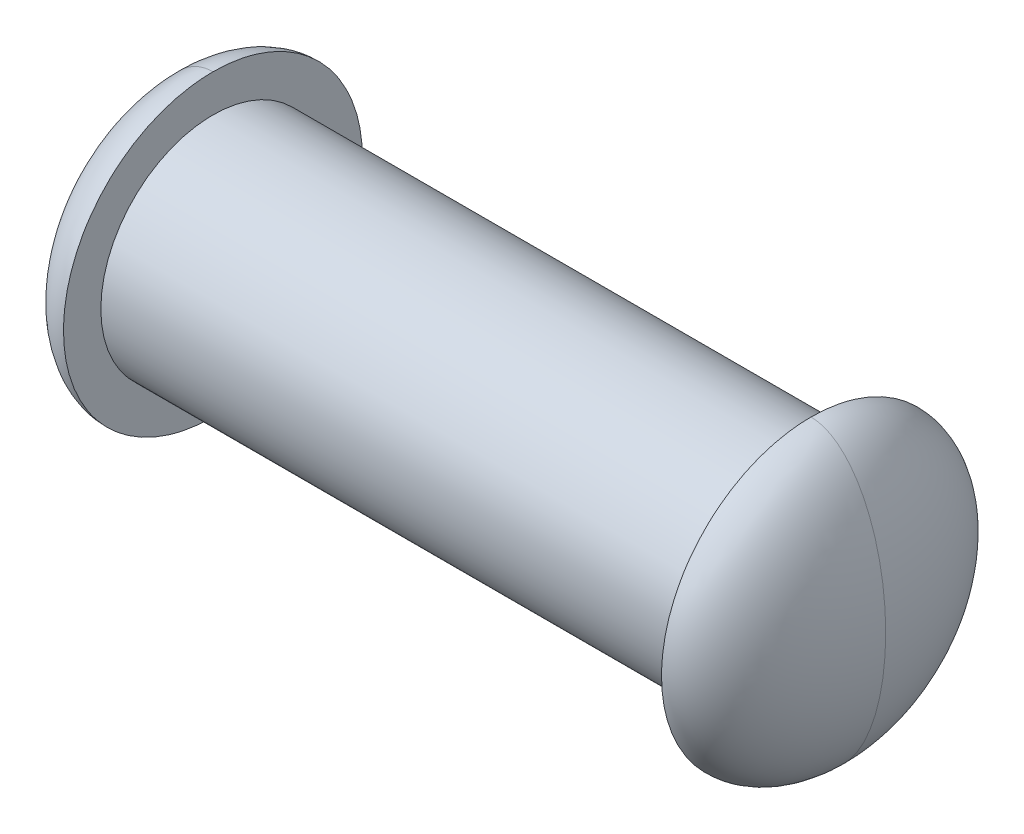
ISO-10303-21;
HEADER;
FILE_DESCRIPTION(('STEP AP214'),'2;1');
FILE_NAME('part.step','',(''),(''),'','','');
FILE_SCHEMA(('AUTOMOTIVE_DESIGN { 1 0 10303 214 1 1 1 1 }'));
ENDSEC;
DATA;
#1=APPLICATION_CONTEXT('core data for automotive mechanical design processes');
#2=APPLICATION_PROTOCOL_DEFINITION('international standard','automotive_design',2000,#1);
#3=PRODUCT_CONTEXT('',#1,'mechanical');
#4=PRODUCT('Part','Part','',(#3));
#5=PRODUCT_RELATED_PRODUCT_CATEGORY('part','',(#4));
#6=PRODUCT_DEFINITION_FORMATION('','',#4);
#7=PRODUCT_DEFINITION_CONTEXT('part definition',#1,'design');
#8=PRODUCT_DEFINITION('design','',#6,#7);
#9=PRODUCT_DEFINITION_SHAPE('','',#8);
#10=(LENGTH_UNIT() NAMED_UNIT(*) SI_UNIT(.MILLI.,.METRE.));
#11=(NAMED_UNIT(*) PLANE_ANGLE_UNIT() SI_UNIT($,.RADIAN.));
#12=(NAMED_UNIT(*) SI_UNIT($,.STERADIAN.) SOLID_ANGLE_UNIT());
#13=UNCERTAINTY_MEASURE_WITH_UNIT(LENGTH_MEASURE(1.E-05),#10,'distance_accuracy_value','');
#14=(GEOMETRIC_REPRESENTATION_CONTEXT(3) GLOBAL_UNCERTAINTY_ASSIGNED_CONTEXT((#13)) GLOBAL_UNIT_ASSIGNED_CONTEXT((#10,
#11,#12)) REPRESENTATION_CONTEXT('',''));
#15=CARTESIAN_POINT('',(0.,0.,0.));
#16=DIRECTION('',(0.,0.,1.));
#17=DIRECTION('',(1.,0.,0.));
#18=AXIS2_PLACEMENT_3D('',#15,#16,#17);
#19=CARTESIAN_POINT('',(-4.,-2.,0.));
#20=CARTESIAN_POINT('',(-4.,-2.,4.));
#21=CARTESIAN_POINT('',(-4.,2.,4.));
#22=CARTESIAN_POINT('',(-4.,2.,0.));
#23=CARTESIAN_POINT('',(-4.585786438,-2.,0.));
#24=CARTESIAN_POINT('',(-4.585786438,-2.,4.));
#25=CARTESIAN_POINT('',(-4.585786438,2.,4.));
#26=CARTESIAN_POINT('',(-4.585786438,2.,0.));
#27=CARTESIAN_POINT('',(-5.,-1.171572875,0.));
#28=CARTESIAN_POINT('',(-5.,-1.171572875,2.343145751));
#29=CARTESIAN_POINT('',(-5.,1.171572875,2.343145751));
#30=CARTESIAN_POINT('',(-5.,1.171572875,0.));
#31=CARTESIAN_POINT('',(-5.,0.,0.));
#32=CARTESIAN_POINT('',(-5.,0.,0.));
#33=CARTESIAN_POINT('',(-5.,0.,0.));
#34=CARTESIAN_POINT('',(-5.,0.,0.));
#35=(BOUNDED_SURFACE() B_SPLINE_SURFACE(3,3,((#19,#20,#21,#22),(#23,#24,#25,#26),(#27,#28,#29,
#30),(#31,#32,#33,#34)),.UNSPECIFIED.,.F.,.F.,.F.) B_SPLINE_SURFACE_WITH_KNOTS((4,4),(4,4),(0.,
1.),(0.,1.),.UNSPECIFIED.) GEOMETRIC_REPRESENTATION_ITEM() RATIONAL_B_SPLINE_SURFACE(((1.,
0.333333333333333,0.333333333333333,1.),(0.804737854124365,0.268245951374788,0.268245951374788,
0.804737854124365),(0.804737854124365,0.268245951374788,0.268245951374788,0.804737854124365),
(1.,0.333333333333333,0.333333333333333,1.))) REPRESENTATION_ITEM('') SURFACE());
#36=CARTESIAN_POINT('',(-4.,-2.,0.));
#37=CARTESIAN_POINT('',(-4.,-1.99999962641447,0.0562680229619233));
#38=CARTESIAN_POINT('',(-4.,-1.99762394300518,0.112509087930596));
#39=CARTESIAN_POINT('',(-4.,-1.9881463739492,0.224588791283825));
#40=CARTESIAN_POINT('',(-4.,-1.98104471460144,0.28042744880788));
#41=CARTESIAN_POINT('',(-4.,-1.95271723958908,0.446648063709757));
#42=CARTESIAN_POINT('',(-4.,-1.92446874657418,0.555916554788708));
#43=CARTESIAN_POINT('',(-4.,-1.85002914799462,0.768155068249139));
#44=CARTESIAN_POINT('',(-4.,-1.80382971785695,0.871122142729097));
#45=CARTESIAN_POINT('',(-4.,-1.69480587148286,1.06783350824989));
#46=CARTESIAN_POINT('',(-4.,-1.63198472136682,1.16157960622734));
#47=CARTESIAN_POINT('',(-4.,-1.49149611993653,1.33719357958562));
#48=CARTESIAN_POINT('',(-4.,-1.41382834132565,1.41906119303309));
#49=CARTESIAN_POINT('',(-4.,-1.24583855555913,1.56860880173396));
#50=CARTESIAN_POINT('',(-4.,-1.15551462307745,1.63628663443956));
#51=CARTESIAN_POINT('',(-4.,-0.964790249798286,1.75551336645388));
#52=CARTESIAN_POINT('',(-4.,-0.864390254004212,1.80706297764236));
#53=CARTESIAN_POINT('',(-4.,-0.656367388949257,1.89257162478123));
#54=CARTESIAN_POINT('',(-4.,-0.548744982224535,1.92653178597954));
#55=CARTESIAN_POINT('',(-4.,-0.329323889979723,1.97590271771947));
#56=CARTESIAN_POINT('',(-4.,-0.217525118924828,1.99131310813408));
#57=CARTESIAN_POINT('',(-4.,0.00707455170492986,2.00314687524351));
#58=CARTESIAN_POINT('',(-4.,0.119875474270174,1.99956981521806));
#59=CARTESIAN_POINT('',(-4.,0.343277698620538,1.97352584666787));
#60=CARTESIAN_POINT('',(-4.,0.453879022201218,1.95105912541404));
#61=CARTESIAN_POINT('',(-4.,0.669728020212934,1.88788698181247));
#62=CARTESIAN_POINT('',(-4.,0.774975711626932,1.84718161732595));
#63=CARTESIAN_POINT('',(-4.,0.977189487563661,1.74863777661584));
#64=CARTESIAN_POINT('',(-4.,1.07415535495195,1.69079885135884));
#65=CARTESIAN_POINT('',(-4.,1.21118381531814,1.59254679176868));
#66=CARTESIAN_POINT('',(-4.,1.25546374327093,1.55787326470221));
#67=CARTESIAN_POINT('',(-4.,1.34099378976153,1.48488999924051));
#68=CARTESIAN_POINT('',(-4.,1.38224094312319,1.44657678398915));
#69=CARTESIAN_POINT('',(-4.,1.50085475444602,1.32666910931567));
#70=CARTESIAN_POINT('',(-4.,1.57321655880106,1.2400183877163));
#71=CARTESIAN_POINT('',(-4.,1.7023417008121,1.05578606563579));
#72=CARTESIAN_POINT('',(-4.,1.75910563171886,0.958204881083524));
#73=CARTESIAN_POINT('',(-4.,1.83136904197552,0.805772155456572));
#74=CARTESIAN_POINT('',(-4.,1.85332586226793,0.753894007216334));
#75=CARTESIAN_POINT('',(-4.,1.89277724350991,0.648500919330629));
#76=CARTESIAN_POINT('',(-4.,1.91027541856335,0.594987344997413));
#77=CARTESIAN_POINT('',(-4.,1.94068278370897,0.486733933235352));
#78=CARTESIAN_POINT('',(-4.,1.95359646502991,0.431995352103915));
#79=CARTESIAN_POINT('',(-4.,1.97476719522395,0.321635163360166));
#80=CARTESIAN_POINT('',(-4.,1.98302560811863,0.266013819318918));
#81=CARTESIAN_POINT('',(-4.,1.99261890883154,0.175226234050916));
#82=CARTESIAN_POINT('',(-4.,1.99538857922048,0.140205275145587));
#83=CARTESIAN_POINT('',(-4.,1.99907778719133,0.0701241102824082));
#84=CARTESIAN_POINT('',(-4.,2.0000003757604,0.0350640649155608));
#85=CARTESIAN_POINT('',(-4.,2.,0.));
#86=B_SPLINE_CURVE_WITH_KNOTS('',3,(#36,#37,#38,#39,#40,#41,#42,#43,#44,#45,#46,#47,#48,#49,#50,
#51,#52,#53,#54,#55,#56,#57,#58,#59,#60,#61,#62,#63,#64,#65,#66,#67,#68,#69,#70,#71,#72,#73,#74,
#75,#76,#77,#78,#79,#80,#81,#82,#83,#84,#85),.UNSPECIFIED.,.F.,.F.,(4,2,2,2,2,2,2,2,2,2,2,2,2,2,
2,2,2,2,2,2,2,2,2,2,4),(0.,0.168700384984718,0.337392692490235,0.674238578630678,
1.01124086057953,1.34817697166002,1.6851205114153,2.02211536469862,2.35909534134666,
2.69605375774872,3.03301907907773,3.36999215080096,3.70696188183357,4.04393054385351,
4.38090803787167,4.54945707455141,4.71816877054622,5.05514437623786,5.39210716359791,
5.56093987110553,5.7296352871162,5.89816498054248,6.06664526805524,6.1719914868906,
6.27716355208919),.UNSPECIFIED.);
#87=CARTESIAN_POINT('',(-4.,-2.,0.));
#88=VERTEX_POINT('',#87);
#89=CARTESIAN_POINT('',(-4.,2.,0.));
#90=VERTEX_POINT('',#89);
#91=EDGE_CURVE('E22',#88,#90,#86,.T.);
#92=CARTESIAN_POINT('',(-4.,2.,0.));
#93=CARTESIAN_POINT('',(-4.585786438,2.,0.));
#94=CARTESIAN_POINT('',(-5.,1.171572875,0.));
#95=CARTESIAN_POINT('',(-5.,0.,0.));
#96=(BOUNDED_CURVE() B_SPLINE_CURVE(3,(#92,#93,#94,#95),.UNSPECIFIED.,.F.,
.F.) B_SPLINE_CURVE_WITH_KNOTS((4,4),(0.,1.),
.UNSPECIFIED.) CURVE() GEOMETRIC_REPRESENTATION_ITEM() RATIONAL_B_SPLINE_CURVE((1.,
0.804737854124365,0.804737854124365,1.)) REPRESENTATION_ITEM(''));
#97=CARTESIAN_POINT('',(-5.,0.,0.));
#98=VERTEX_POINT('',#97);
#99=EDGE_CURVE('E59',#90,#98,#96,.T.);
#100=CARTESIAN_POINT('',(-4.,-2.,0.));
#101=CARTESIAN_POINT('',(-4.585786438,-2.,0.));
#102=CARTESIAN_POINT('',(-5.,-1.171572875,0.));
#103=CARTESIAN_POINT('',(-5.,0.,0.));
#104=(BOUNDED_CURVE() B_SPLINE_CURVE(3,(#100,#101,#102,#103),.UNSPECIFIED.,.F.,
.F.) B_SPLINE_CURVE_WITH_KNOTS((4,4),(0.,1.),
.UNSPECIFIED.) CURVE() GEOMETRIC_REPRESENTATION_ITEM() RATIONAL_B_SPLINE_CURVE((1.,
0.804737854124365,0.804737854124365,1.)) REPRESENTATION_ITEM(''));
#105=EDGE_CURVE('E62',#98,#88,#104,.F.);
#106=ORIENTED_EDGE('',*,*,#91,.T.);
#107=ORIENTED_EDGE('',*,*,#99,.T.);
#108=ORIENTED_EDGE('',*,*,#105,.T.);
#109=EDGE_LOOP('',(#106,#107,#108));
#110=FACE_BOUND('',#109,.T.);
#111=ADVANCED_FACE('F17',(#110),#35,.F.);
#112=CARTESIAN_POINT('',(-4.,2.,0.));
#113=CARTESIAN_POINT('',(-4.,2.,-4.));
#114=CARTESIAN_POINT('',(-4.,-2.,-4.));
#115=CARTESIAN_POINT('',(-4.,-2.,0.));
#116=CARTESIAN_POINT('',(-4.585786438,2.,0.));
#117=CARTESIAN_POINT('',(-4.585786438,2.,-4.));
#118=CARTESIAN_POINT('',(-4.585786438,-2.,-4.));
#119=CARTESIAN_POINT('',(-4.585786438,-2.,0.));
#120=CARTESIAN_POINT('',(-5.,1.171572875,0.));
#121=CARTESIAN_POINT('',(-5.,1.171572875,-2.343145751));
#122=CARTESIAN_POINT('',(-5.,-1.171572875,-2.343145751));
#123=CARTESIAN_POINT('',(-5.,-1.171572875,0.));
#124=CARTESIAN_POINT('',(-5.,0.,0.));
#125=CARTESIAN_POINT('',(-5.,0.,0.));
#126=CARTESIAN_POINT('',(-5.,0.,0.));
#127=CARTESIAN_POINT('',(-5.,0.,0.));
#128=(BOUNDED_SURFACE() B_SPLINE_SURFACE(3,3,((#112,#113,#114,#115),(#116,#117,#118,#119),(#120,
#121,#122,#123),(#124,#125,#126,#127)),.UNSPECIFIED.,.F.,.F.,
.F.) B_SPLINE_SURFACE_WITH_KNOTS((4,4),(4,4),(0.,1.),(0.,1.),
.UNSPECIFIED.) GEOMETRIC_REPRESENTATION_ITEM() RATIONAL_B_SPLINE_SURFACE(((1.,0.333333333333333,
0.333333333333333,1.),(0.804737854124365,0.268245951374788,0.268245951374788,0.804737854124365),
(0.804737854124365,0.268245951374788,0.268245951374788,0.804737854124365),(1.,0.333333333333333,
0.333333333333333,1.))) REPRESENTATION_ITEM('') SURFACE());
#129=CARTESIAN_POINT('',(-4.,2.,0.));
#130=CARTESIAN_POINT('',(-4.,1.99999962641447,-0.0562680229619233));
#131=CARTESIAN_POINT('',(-4.,1.99762394300518,-0.112509087930596));
#132=CARTESIAN_POINT('',(-4.,1.9881463739492,-0.224588791283825));
#133=CARTESIAN_POINT('',(-4.,1.98104471460144,-0.28042744880788));
#134=CARTESIAN_POINT('',(-4.,1.95271723958908,-0.446648063709757));
#135=CARTESIAN_POINT('',(-4.,1.92446874657418,-0.555916554788708));
#136=CARTESIAN_POINT('',(-4.,1.85002914799462,-0.768155068249139));
#137=CARTESIAN_POINT('',(-4.,1.80382971785695,-0.871122142729097));
#138=CARTESIAN_POINT('',(-4.,1.69480587148286,-1.06783350824989));
#139=CARTESIAN_POINT('',(-4.,1.63198472136682,-1.16157960622734));
#140=CARTESIAN_POINT('',(-4.,1.49149611993653,-1.33719357958562));
#141=CARTESIAN_POINT('',(-4.,1.41382834132565,-1.41906119303309));
#142=CARTESIAN_POINT('',(-4.,1.24583855555913,-1.56860880173396));
#143=CARTESIAN_POINT('',(-4.,1.15551462307745,-1.63628663443956));
#144=CARTESIAN_POINT('',(-4.,0.964790249798286,-1.75551336645388));
#145=CARTESIAN_POINT('',(-4.,0.864390254004212,-1.80706297764236));
#146=CARTESIAN_POINT('',(-4.,0.656367388949257,-1.89257162478123));
#147=CARTESIAN_POINT('',(-4.,0.548744982224535,-1.92653178597954));
#148=CARTESIAN_POINT('',(-4.,0.329323889979723,-1.97590271771947));
#149=CARTESIAN_POINT('',(-4.,0.217525118924828,-1.99131310813408));
#150=CARTESIAN_POINT('',(-4.,-0.00707455170492986,-2.00314687524351));
#151=CARTESIAN_POINT('',(-4.,-0.119875474270174,-1.99956981521806));
#152=CARTESIAN_POINT('',(-4.,-0.343277698620538,-1.97352584666787));
#153=CARTESIAN_POINT('',(-4.,-0.453879022201218,-1.95105912541404));
#154=CARTESIAN_POINT('',(-4.,-0.669728020212934,-1.88788698181247));
#155=CARTESIAN_POINT('',(-4.,-0.774975711626932,-1.84718161732595));
#156=CARTESIAN_POINT('',(-4.,-0.977189487563661,-1.74863777661584));
#157=CARTESIAN_POINT('',(-4.,-1.07415535495195,-1.69079885135884));
#158=CARTESIAN_POINT('',(-4.,-1.21118381531814,-1.59254679176868));
#159=CARTESIAN_POINT('',(-4.,-1.25546374327093,-1.55787326470221));
#160=CARTESIAN_POINT('',(-4.,-1.34099378976153,-1.48488999924051));
#161=CARTESIAN_POINT('',(-4.,-1.38224094312319,-1.44657678398915));
#162=CARTESIAN_POINT('',(-4.,-1.50085475444602,-1.32666910931567));
#163=CARTESIAN_POINT('',(-4.,-1.57321655880106,-1.2400183877163));
#164=CARTESIAN_POINT('',(-4.,-1.7023417008121,-1.05578606563579));
#165=CARTESIAN_POINT('',(-4.,-1.75910563171886,-0.958204881083524));
#166=CARTESIAN_POINT('',(-4.,-1.83136904197552,-0.805772155456572));
#167=CARTESIAN_POINT('',(-4.,-1.85332586226793,-0.753894007216334));
#168=CARTESIAN_POINT('',(-4.,-1.89277724350991,-0.648500919330629));
#169=CARTESIAN_POINT('',(-4.,-1.91027541856335,-0.594987344997413));
#170=CARTESIAN_POINT('',(-4.,-1.94068278370897,-0.486733933235352));
#171=CARTESIAN_POINT('',(-4.,-1.95359646502991,-0.431995352103915));
#172=CARTESIAN_POINT('',(-4.,-1.97476719522395,-0.321635163360166));
#173=CARTESIAN_POINT('',(-4.,-1.98302560811863,-0.266013819318918));
#174=CARTESIAN_POINT('',(-4.,-1.99261890883154,-0.175226234050916));
#175=CARTESIAN_POINT('',(-4.,-1.99538857922048,-0.140205275145587));
#176=CARTESIAN_POINT('',(-4.,-1.99907778719133,-0.0701241102824082));
#177=CARTESIAN_POINT('',(-4.,-2.0000003757604,-0.0350640649155608));
#178=CARTESIAN_POINT('',(-4.,-2.,0.));
#179=B_SPLINE_CURVE_WITH_KNOTS('',3,(#129,#130,#131,#132,#133,#134,#135,#136,#137,#138,#139,
#140,#141,#142,#143,#144,#145,#146,#147,#148,#149,#150,#151,#152,#153,#154,#155,#156,#157,#158,
#159,#160,#161,#162,#163,#164,#165,#166,#167,#168,#169,#170,#171,#172,#173,#174,#175,#176,#177,
#178),.UNSPECIFIED.,.F.,.F.,(4,2,2,2,2,2,2,2,2,2,2,2,2,2,2,2,2,2,2,2,2,2,2,2,4),(0.,
0.168700384984718,0.337392692490235,0.674238578630678,1.01124086057953,1.34817697166002,
1.6851205114153,2.02211536469862,2.35909534134666,2.69605375774872,3.03301907907773,
3.36999215080096,3.70696188183357,4.04393054385351,4.38090803787167,4.54945707455141,
4.71816877054622,5.05514437623786,5.39210716359791,5.56093987110553,5.7296352871162,
5.89816498054248,6.06664526805524,6.1719914868906,6.27716355208919),.UNSPECIFIED.);
#180=EDGE_CURVE('E61',#90,#88,#179,.T.);
#181=ORIENTED_EDGE('',*,*,#105,.F.);
#182=ORIENTED_EDGE('',*,*,#99,.F.);
#183=ORIENTED_EDGE('',*,*,#180,.T.);
#184=EDGE_LOOP('',(#181,#182,#183));
#185=FACE_BOUND('',#184,.T.);
#186=ADVANCED_FACE('F60',(#185),#128,.F.);
#187=CARTESIAN_POINT('',(-4.,2.024,-2.024));
#188=DIRECTION('',(-1.,0.,0.));
#189=DIRECTION('',(0.,-1.,0.));
#190=AXIS2_PLACEMENT_3D('',#187,#188,#189);
#191=PLANE('',#190);
#192=CARTESIAN_POINT('',(-4.,0.,0.));
#193=DIRECTION('',(-1.,0.,0.));
#194=DIRECTION('',(0.,0.,1.));
#195=AXIS2_PLACEMENT_3D('',#192,#193,#194);
#196=CIRCLE('',#195,1.5);
#197=CARTESIAN_POINT('',(-4.,0.,1.5));
#198=VERTEX_POINT('',#197);
#199=EDGE_CURVE('E66',#198,#198,#196,.T.);
#200=ORIENTED_EDGE('',*,*,#199,.T.);
#201=EDGE_LOOP('',(#200));
#202=FACE_BOUND('',#201,.T.);
#203=ORIENTED_EDGE('',*,*,#91,.F.);
#204=ORIENTED_EDGE('',*,*,#180,.F.);
#205=EDGE_LOOP('',(#203,#204));
#206=FACE_BOUND('',#205,.T.);
#207=ADVANCED_FACE('F65',(#202,#206),#191,.F.);
#208=CARTESIAN_POINT('',(4.,0.,0.));
#209=DIRECTION('',(-1.,0.,0.));
#210=DIRECTION('',(0.,0.,1.));
#211=AXIS2_PLACEMENT_3D('',#208,#209,#210);
#212=CYLINDRICAL_SURFACE('',#211,1.5);
#213=ORIENTED_EDGE('',*,*,#199,.F.);
#214=EDGE_LOOP('',(#213));
#215=FACE_BOUND('',#214,.T.);
#216=CARTESIAN_POINT('',(4.,0.,0.));
#217=DIRECTION('',(-1.,0.,0.));
#218=DIRECTION('',(0.,0.,1.));
#219=AXIS2_PLACEMENT_3D('',#216,#217,#218);
#220=CIRCLE('',#219,1.5);
#221=CARTESIAN_POINT('',(4.,0.,1.5));
#222=VERTEX_POINT('',#221);
#223=EDGE_CURVE('E153',#222,#222,#220,.T.);
#224=ORIENTED_EDGE('',*,*,#223,.T.);
#225=EDGE_LOOP('',(#224));
#226=FACE_BOUND('',#225,.T.);
#227=ADVANCED_FACE('F118',(#215,#226),#212,.T.);
#228=CARTESIAN_POINT('',(4.,-2.024,-2.024));
#229=DIRECTION('',(1.,0.,0.));
#230=DIRECTION('',(0.,1.,0.));
#231=AXIS2_PLACEMENT_3D('',#228,#229,#230);
#232=PLANE('',#231);
#233=ORIENTED_EDGE('',*,*,#223,.F.);
#234=EDGE_LOOP('',(#233));
#235=FACE_BOUND('',#234,.T.);
#236=CARTESIAN_POINT('',(4.,-2.,0.));
#237=CARTESIAN_POINT('',(4.,-1.99999962641447,0.0562680229619233));
#238=CARTESIAN_POINT('',(4.,-1.99762394300518,0.112509087930596));
#239=CARTESIAN_POINT('',(4.,-1.9881463739492,0.224588791283825));
#240=CARTESIAN_POINT('',(4.,-1.98104471460144,0.28042744880788));
#241=CARTESIAN_POINT('',(4.,-1.95271723958908,0.446648063709757));
#242=CARTESIAN_POINT('',(4.,-1.92446874657418,0.555916554788708));
#243=CARTESIAN_POINT('',(4.,-1.85002914799462,0.768155068249139));
#244=CARTESIAN_POINT('',(4.,-1.80382971785695,0.871122142729097));
#245=CARTESIAN_POINT('',(4.,-1.69480587148286,1.06783350824989));
#246=CARTESIAN_POINT('',(4.,-1.63198472136682,1.16157960622734));
#247=CARTESIAN_POINT('',(4.,-1.49149611993653,1.33719357958562));
#248=CARTESIAN_POINT('',(4.,-1.41382834132565,1.41906119303309));
#249=CARTESIAN_POINT('',(4.,-1.24583855555913,1.56860880173396));
#250=CARTESIAN_POINT('',(4.,-1.15551462307744,1.63628663443956));
#251=CARTESIAN_POINT('',(4.,-0.964790249798285,1.75551336645388));
#252=CARTESIAN_POINT('',(4.,-0.864390254004212,1.80706297764236));
#253=CARTESIAN_POINT('',(4.,-0.656367388949256,1.89257162478123));
#254=CARTESIAN_POINT('',(4.,-0.548744982224535,1.92653178597954));
#255=CARTESIAN_POINT('',(4.,-0.329323889979722,1.97590271771947));
#256=CARTESIAN_POINT('',(4.,-0.217525118924827,1.99131310813408));
#257=CARTESIAN_POINT('',(4.,0.00707455170493081,2.00314687524351));
#258=CARTESIAN_POINT('',(4.,0.119875474270175,1.99956981521806));
#259=CARTESIAN_POINT('',(4.,0.343277698620539,1.97352584666787));
#260=CARTESIAN_POINT('',(4.,0.453879022201218,1.95105912541404));
#261=CARTESIAN_POINT('',(4.,0.669728020212935,1.88788698181247));
#262=CARTESIAN_POINT('',(4.,0.774975711626933,1.84718161732594));
#263=CARTESIAN_POINT('',(4.,0.977189487563661,1.74863777661584));
#264=CARTESIAN_POINT('',(4.,1.07415535495195,1.69079885135884));
#265=CARTESIAN_POINT('',(4.,1.21118381531814,1.59254679176868));
#266=CARTESIAN_POINT('',(4.,1.25546374327093,1.55787326470221));
#267=CARTESIAN_POINT('',(4.,1.34099378976153,1.48488999924051));
#268=CARTESIAN_POINT('',(4.,1.38224094312319,1.44657678398915));
#269=CARTESIAN_POINT('',(4.,1.50085475444602,1.32666910931567));
#270=CARTESIAN_POINT('',(4.,1.57321655880106,1.2400183877163));
#271=CARTESIAN_POINT('',(4.,1.7023417008121,1.05578606563579));
#272=CARTESIAN_POINT('',(4.,1.75910563171886,0.958204881083524));
#273=CARTESIAN_POINT('',(4.,1.83136904197552,0.805772155456572));
#274=CARTESIAN_POINT('',(4.,1.85332586226793,0.753894007216334));
#275=CARTESIAN_POINT('',(4.,1.89277724350991,0.648500919330629));
#276=CARTESIAN_POINT('',(4.,1.91027541856335,0.594987344997413));
#277=CARTESIAN_POINT('',(4.,1.94068278370897,0.486733933235352));
#278=CARTESIAN_POINT('',(4.,1.95359646502991,0.431995352103915));
#279=CARTESIAN_POINT('',(4.,1.97476719522395,0.321635163360166));
#280=CARTESIAN_POINT('',(4.,1.98302560811863,0.266013819318918));
#281=CARTESIAN_POINT('',(4.,1.99261890883154,0.175226234050916));
#282=CARTESIAN_POINT('',(4.,1.99538857922048,0.140205275145587));
#283=CARTESIAN_POINT('',(4.,1.99907778719133,0.0701241102824082));
#284=CARTESIAN_POINT('',(4.,2.0000003757604,0.0350640649155608));
#285=CARTESIAN_POINT('',(4.,2.,0.));
#286=B_SPLINE_CURVE_WITH_KNOTS('',3,(#236,#237,#238,#239,#240,#241,#242,#243,#244,#245,#246,
#247,#248,#249,#250,#251,#252,#253,#254,#255,#256,#257,#258,#259,#260,#261,#262,#263,#264,#265,
#266,#267,#268,#269,#270,#271,#272,#273,#274,#275,#276,#277,#278,#279,#280,#281,#282,#283,#284,
#285),.UNSPECIFIED.,.F.,.F.,(4,2,2,2,2,2,2,2,2,2,2,2,2,2,2,2,2,2,2,2,2,2,2,2,4),(0.,
0.168700384984718,0.337392692490235,0.674238578630678,1.01124086057953,1.34817697166002,
1.6851205114153,2.02211536469862,2.35909534134666,2.69605375774872,3.03301907907773,
3.36999215080096,3.70696188183357,4.04393054385352,4.38090803787167,4.54945707455141,
4.71816877054622,5.05514437623786,5.39210716359791,5.56093987110553,5.7296352871162,
5.89816498054248,6.06664526805524,6.1719914868906,6.27716355208919),.UNSPECIFIED.);
#287=CARTESIAN_POINT('',(4.,-2.,0.));
#288=VERTEX_POINT('',#287);
#289=CARTESIAN_POINT('',(4.,2.,0.));
#290=VERTEX_POINT('',#289);
#291=EDGE_CURVE('E94',#288,#290,#286,.T.);
#292=ORIENTED_EDGE('',*,*,#291,.T.);
#293=CARTESIAN_POINT('',(4.,2.,0.));
#294=CARTESIAN_POINT('',(4.,1.99999962641447,-0.0562680229619233));
#295=CARTESIAN_POINT('',(4.,1.99762394300518,-0.112509087930596));
#296=CARTESIAN_POINT('',(4.,1.9881463739492,-0.224588791283825));
#297=CARTESIAN_POINT('',(4.,1.98104471460144,-0.28042744880788));
#298=CARTESIAN_POINT('',(4.,1.95271723958908,-0.446648063709757));
#299=CARTESIAN_POINT('',(4.,1.92446874657418,-0.555916554788708));
#300=CARTESIAN_POINT('',(4.,1.85002914799462,-0.768155068249139));
#301=CARTESIAN_POINT('',(4.,1.80382971785695,-0.871122142729097));
#302=CARTESIAN_POINT('',(4.,1.69480587148286,-1.06783350824989));
#303=CARTESIAN_POINT('',(4.,1.63198472136682,-1.16157960622734));
#304=CARTESIAN_POINT('',(4.,1.49149611993653,-1.33719357958562));
#305=CARTESIAN_POINT('',(4.,1.41382834132565,-1.41906119303309));
#306=CARTESIAN_POINT('',(4.,1.24583855555913,-1.56860880173396));
#307=CARTESIAN_POINT('',(4.,1.15551462307744,-1.63628663443956));
#308=CARTESIAN_POINT('',(4.,0.964790249798285,-1.75551336645388));
#309=CARTESIAN_POINT('',(4.,0.864390254004212,-1.80706297764236));
#310=CARTESIAN_POINT('',(4.,0.656367388949256,-1.89257162478123));
#311=CARTESIAN_POINT('',(4.,0.548744982224535,-1.92653178597954));
#312=CARTESIAN_POINT('',(4.,0.329323889979722,-1.97590271771947));
#313=CARTESIAN_POINT('',(4.,0.217525118924827,-1.99131310813408));
#314=CARTESIAN_POINT('',(4.,-0.00707455170493081,-2.00314687524351));
#315=CARTESIAN_POINT('',(4.,-0.119875474270175,-1.99956981521806));
#316=CARTESIAN_POINT('',(4.,-0.343277698620539,-1.97352584666787));
#317=CARTESIAN_POINT('',(4.,-0.453879022201218,-1.95105912541404));
#318=CARTESIAN_POINT('',(4.,-0.669728020212935,-1.88788698181247));
#319=CARTESIAN_POINT('',(4.,-0.774975711626933,-1.84718161732594));
#320=CARTESIAN_POINT('',(4.,-0.977189487563661,-1.74863777661584));
#321=CARTESIAN_POINT('',(4.,-1.07415535495195,-1.69079885135884));
#322=CARTESIAN_POINT('',(4.,-1.21118381531814,-1.59254679176868));
#323=CARTESIAN_POINT('',(4.,-1.25546374327093,-1.55787326470221));
#324=CARTESIAN_POINT('',(4.,-1.34099378976153,-1.48488999924051));
#325=CARTESIAN_POINT('',(4.,-1.38224094312319,-1.44657678398915));
#326=CARTESIAN_POINT('',(4.,-1.50085475444602,-1.32666910931567));
#327=CARTESIAN_POINT('',(4.,-1.57321655880106,-1.2400183877163));
#328=CARTESIAN_POINT('',(4.,-1.7023417008121,-1.05578606563579));
#329=CARTESIAN_POINT('',(4.,-1.75910563171886,-0.958204881083524));
#330=CARTESIAN_POINT('',(4.,-1.83136904197552,-0.805772155456572));
#331=CARTESIAN_POINT('',(4.,-1.85332586226793,-0.753894007216334));
#332=CARTESIAN_POINT('',(4.,-1.89277724350991,-0.648500919330629));
#333=CARTESIAN_POINT('',(4.,-1.91027541856335,-0.594987344997413));
#334=CARTESIAN_POINT('',(4.,-1.94068278370897,-0.486733933235352));
#335=CARTESIAN_POINT('',(4.,-1.95359646502991,-0.431995352103915));
#336=CARTESIAN_POINT('',(4.,-1.97476719522395,-0.321635163360166));
#337=CARTESIAN_POINT('',(4.,-1.98302560811863,-0.266013819318918));
#338=CARTESIAN_POINT('',(4.,-1.99261890883154,-0.175226234050916));
#339=CARTESIAN_POINT('',(4.,-1.99538857922048,-0.140205275145587));
#340=CARTESIAN_POINT('',(4.,-1.99907778719133,-0.0701241102824082));
#341=CARTESIAN_POINT('',(4.,-2.0000003757604,-0.0350640649155608));
#342=CARTESIAN_POINT('',(4.,-2.,0.));
#343=B_SPLINE_CURVE_WITH_KNOTS('',3,(#293,#294,#295,#296,#297,#298,#299,#300,#301,#302,#303,
#304,#305,#306,#307,#308,#309,#310,#311,#312,#313,#314,#315,#316,#317,#318,#319,#320,#321,#322,
#323,#324,#325,#326,#327,#328,#329,#330,#331,#332,#333,#334,#335,#336,#337,#338,#339,#340,#341,
#342),.UNSPECIFIED.,.F.,.F.,(4,2,2,2,2,2,2,2,2,2,2,2,2,2,2,2,2,2,2,2,2,2,2,2,4),(0.,
0.168700384984718,0.337392692490235,0.674238578630678,1.01124086057953,1.34817697166002,
1.6851205114153,2.02211536469862,2.35909534134666,2.69605375774872,3.03301907907773,
3.36999215080096,3.70696188183357,4.04393054385352,4.38090803787167,4.54945707455141,
4.71816877054622,5.05514437623786,5.39210716359791,5.56093987110553,5.7296352871162,
5.89816498054248,6.06664526805524,6.1719914868906,6.27716355208919),.UNSPECIFIED.);
#344=EDGE_CURVE('E83',#290,#288,#343,.T.);
#345=ORIENTED_EDGE('',*,*,#344,.T.);
#346=EDGE_LOOP('',(#292,#345));
#347=FACE_BOUND('',#346,.T.);
#348=ADVANCED_FACE('F19',(#235,#347),#232,.F.);
#349=CARTESIAN_POINT('',(5.,0.,0.));
#350=CARTESIAN_POINT('',(5.,0.,0.));
#351=CARTESIAN_POINT('',(5.,0.,0.));
#352=CARTESIAN_POINT('',(5.,0.,0.));
#353=CARTESIAN_POINT('',(5.,-1.171572875,0.));
#354=CARTESIAN_POINT('',(5.,-1.171572875,2.343145751));
#355=CARTESIAN_POINT('',(5.,1.171572875,2.343145751));
#356=CARTESIAN_POINT('',(5.,1.171572875,0.));
#357=CARTESIAN_POINT('',(4.585786438,-2.,0.));
#358=CARTESIAN_POINT('',(4.585786438,-2.,4.));
#359=CARTESIAN_POINT('',(4.585786438,2.,4.));
#360=CARTESIAN_POINT('',(4.585786438,2.,0.));
#361=CARTESIAN_POINT('',(4.,-2.,0.));
#362=CARTESIAN_POINT('',(4.,-2.,4.));
#363=CARTESIAN_POINT('',(4.,2.,4.));
#364=CARTESIAN_POINT('',(4.,2.,0.));
#365=(BOUNDED_SURFACE() B_SPLINE_SURFACE(3,3,((#349,#350,#351,#352),(#353,#354,#355,#356),(#357,
#358,#359,#360),(#361,#362,#363,#364)),.UNSPECIFIED.,.F.,.F.,
.F.) B_SPLINE_SURFACE_WITH_KNOTS((4,4),(4,4),(0.,1.),(0.,1.),
.UNSPECIFIED.) GEOMETRIC_REPRESENTATION_ITEM() RATIONAL_B_SPLINE_SURFACE(((1.,0.333333333333333,
0.333333333333333,1.),(0.804737854124365,0.268245951374789,0.268245951374789,0.804737854124365),
(0.804737854124365,0.268245951374789,0.268245951374789,0.804737854124365),(1.,0.333333333333333,
0.333333333333333,1.))) REPRESENTATION_ITEM('') SURFACE());
#366=CARTESIAN_POINT('',(5.,0.,0.));
#367=CARTESIAN_POINT('',(5.,1.171572875,0.));
#368=CARTESIAN_POINT('',(4.585786438,2.,0.));
#369=CARTESIAN_POINT('',(4.,2.,0.));
#370=(BOUNDED_CURVE() B_SPLINE_CURVE(3,(#366,#367,#368,#369),.UNSPECIFIED.,.F.,
.F.) B_SPLINE_CURVE_WITH_KNOTS((4,4),(0.,1.),
.UNSPECIFIED.) CURVE() GEOMETRIC_REPRESENTATION_ITEM() RATIONAL_B_SPLINE_CURVE((1.,
0.804737854124365,0.804737854124365,1.)) REPRESENTATION_ITEM(''));
#371=CARTESIAN_POINT('',(5.,0.,0.));
#372=VERTEX_POINT('',#371);
#373=EDGE_CURVE('E11',#372,#290,#370,.T.);
#374=CARTESIAN_POINT('',(5.,0.,0.));
#375=CARTESIAN_POINT('',(5.,-1.171572875,0.));
#376=CARTESIAN_POINT('',(4.585786438,-2.,0.));
#377=CARTESIAN_POINT('',(4.,-2.,0.));
#378=(BOUNDED_CURVE() B_SPLINE_CURVE(3,(#374,#375,#376,#377),.UNSPECIFIED.,.F.,
.F.) B_SPLINE_CURVE_WITH_KNOTS((4,4),(0.,1.),
.UNSPECIFIED.) CURVE() GEOMETRIC_REPRESENTATION_ITEM() RATIONAL_B_SPLINE_CURVE((1.,
0.804737854124365,0.804737854124365,1.)) REPRESENTATION_ITEM(''));
#379=EDGE_CURVE('E33',#288,#372,#378,.F.);
#380=ORIENTED_EDGE('',*,*,#373,.T.);
#381=ORIENTED_EDGE('',*,*,#291,.F.);
#382=ORIENTED_EDGE('',*,*,#379,.T.);
#383=EDGE_LOOP('',(#380,#381,#382));
#384=FACE_BOUND('',#383,.T.);
#385=ADVANCED_FACE('F106',(#384),#365,.F.);
#386=CARTESIAN_POINT('',(5.,0.,0.));
#387=CARTESIAN_POINT('',(5.,0.,0.));
#388=CARTESIAN_POINT('',(5.,0.,0.));
#389=CARTESIAN_POINT('',(5.,0.,0.));
#390=CARTESIAN_POINT('',(5.,1.171572875,0.));
#391=CARTESIAN_POINT('',(5.,1.171572875,-2.343145751));
#392=CARTESIAN_POINT('',(5.,-1.171572875,-2.343145751));
#393=CARTESIAN_POINT('',(5.,-1.171572875,0.));
#394=CARTESIAN_POINT('',(4.585786438,2.,0.));
#395=CARTESIAN_POINT('',(4.585786438,2.,-4.));
#396=CARTESIAN_POINT('',(4.585786438,-2.,-4.));
#397=CARTESIAN_POINT('',(4.585786438,-2.,0.));
#398=CARTESIAN_POINT('',(4.,2.,0.));
#399=CARTESIAN_POINT('',(4.,2.,-4.));
#400=CARTESIAN_POINT('',(4.,-2.,-4.));
#401=CARTESIAN_POINT('',(4.,-2.,0.));
#402=(BOUNDED_SURFACE() B_SPLINE_SURFACE(3,3,((#386,#387,#388,#389),(#390,#391,#392,#393),(#394,
#395,#396,#397),(#398,#399,#400,#401)),.UNSPECIFIED.,.F.,.F.,
.F.) B_SPLINE_SURFACE_WITH_KNOTS((4,4),(4,4),(0.,1.),(0.,1.),
.UNSPECIFIED.) GEOMETRIC_REPRESENTATION_ITEM() RATIONAL_B_SPLINE_SURFACE(((1.,0.333333333333333,
0.333333333333333,1.),(0.804737854124365,0.268245951374789,0.268245951374789,0.804737854124365),
(0.804737854124365,0.268245951374789,0.268245951374789,0.804737854124365),(1.,0.333333333333333,
0.333333333333333,1.))) REPRESENTATION_ITEM('') SURFACE());
#403=ORIENTED_EDGE('',*,*,#379,.F.);
#404=ORIENTED_EDGE('',*,*,#344,.F.);
#405=ORIENTED_EDGE('',*,*,#373,.F.);
#406=EDGE_LOOP('',(#403,#404,#405));
#407=FACE_BOUND('',#406,.T.);
#408=ADVANCED_FACE('F101',(#407),#402,.F.);
#409=CLOSED_SHELL('',(#111,#186,#207,#227,#348,#385,#408));
#410=MANIFOLD_SOLID_BREP('B1',#409);
#411=ADVANCED_BREP_SHAPE_REPRESENTATION('',(#18,#410),#14);
#412=SHAPE_DEFINITION_REPRESENTATION(#9,#411);
ENDSEC;
END-ISO-10303-21;
